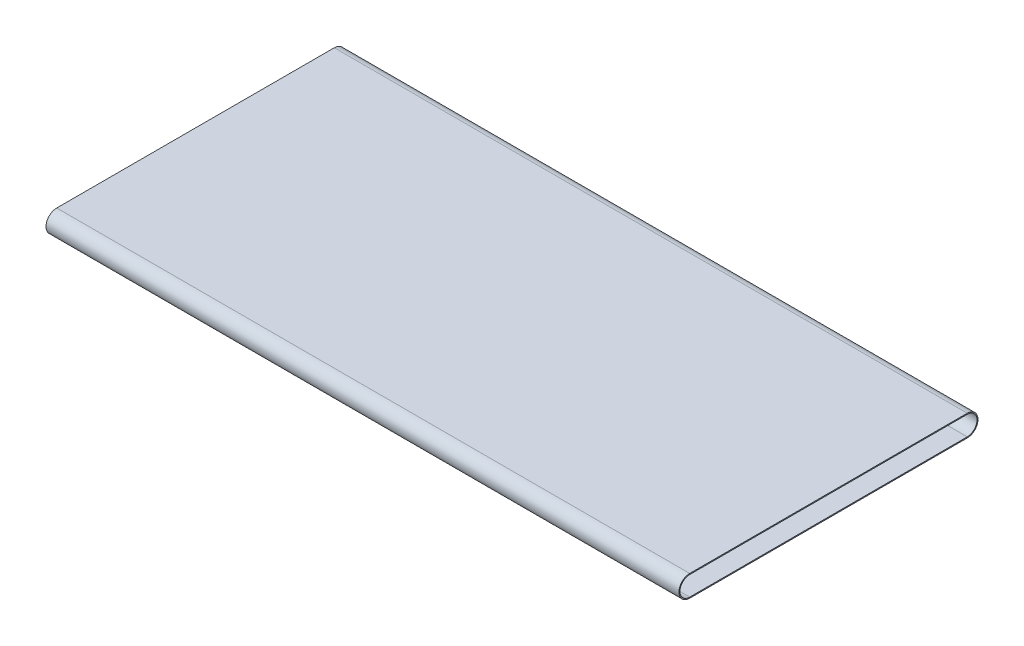
ISO-10303-21;
HEADER;
FILE_DESCRIPTION(('STEP AP214'),'2;1');
FILE_NAME('part.step','',(''),(''),'','','');
FILE_SCHEMA(('AUTOMOTIVE_DESIGN { 1 0 10303 214 1 1 1 1 }'));
ENDSEC;
DATA;
#1=APPLICATION_CONTEXT('core data for automotive mechanical design processes');
#2=APPLICATION_PROTOCOL_DEFINITION('international standard','automotive_design',2000,#1);
#3=PRODUCT_CONTEXT('',#1,'mechanical');
#4=PRODUCT('Part','Part','',(#3));
#5=PRODUCT_RELATED_PRODUCT_CATEGORY('part','',(#4));
#6=PRODUCT_DEFINITION_FORMATION('','',#4);
#7=PRODUCT_DEFINITION_CONTEXT('part definition',#1,'design');
#8=PRODUCT_DEFINITION('design','',#6,#7);
#9=PRODUCT_DEFINITION_SHAPE('','',#8);
#10=(LENGTH_UNIT() NAMED_UNIT(*) SI_UNIT(.MILLI.,.METRE.));
#11=(NAMED_UNIT(*) PLANE_ANGLE_UNIT() SI_UNIT($,.RADIAN.));
#12=(NAMED_UNIT(*) SI_UNIT($,.STERADIAN.) SOLID_ANGLE_UNIT());
#13=UNCERTAINTY_MEASURE_WITH_UNIT(LENGTH_MEASURE(1.E-05),#10,'distance_accuracy_value','');
#14=(GEOMETRIC_REPRESENTATION_CONTEXT(3) GLOBAL_UNCERTAINTY_ASSIGNED_CONTEXT((#13)) GLOBAL_UNIT_ASSIGNED_CONTEXT((#10,
#11,#12)) REPRESENTATION_CONTEXT('',''));
#15=CARTESIAN_POINT('',(0.,0.,0.));
#16=DIRECTION('',(0.,0.,1.));
#17=DIRECTION('',(1.,0.,0.));
#18=AXIS2_PLACEMENT_3D('',#15,#16,#17);
#19=CARTESIAN_POINT('',(3962.4,0.,0.));
#20=DIRECTION('',(1.,0.,0.));
#21=DIRECTION('',(0.,0.,-1.));
#22=AXIS2_PLACEMENT_3D('',#19,#20,#21);
#23=PLANE('',#22);
#24=CARTESIAN_POINT('',(3962.4,0.,0.));
#25=DIRECTION('',(1.,0.,0.));
#26=DIRECTION('',(0.,0.,-1.));
#27=AXIS2_PLACEMENT_3D('',#24,#25,#26);
#28=CIRCLE('',#27,67.31);
#29=CARTESIAN_POINT('',(3962.4,-67.31,0.));
#30=VERTEX_POINT('',#29);
#31=CARTESIAN_POINT('',(3962.4,67.31,0.));
#32=VERTEX_POINT('',#31);
#33=EDGE_CURVE('E137',#30,#32,#28,.T.);
#34=ORIENTED_EDGE('',*,*,#33,.T.);
#35=DIRECTION('',(0.,0.,1.));
#36=VECTOR('',#35,1.);
#37=CARTESIAN_POINT('',(3962.4,67.31,0.));
#38=LINE('',#37,#36);
#39=CARTESIAN_POINT('',(3962.4,67.3099999999999,1737.36));
#40=VERTEX_POINT('',#39);
#41=EDGE_CURVE('E140',#32,#40,#38,.T.);
#42=ORIENTED_EDGE('',*,*,#41,.T.);
#43=CARTESIAN_POINT('',(3962.4,0.,1737.36));
#44=DIRECTION('',(1.,0.,0.));
#45=DIRECTION('',(0.,0.,-1.));
#46=AXIS2_PLACEMENT_3D('',#43,#44,#45);
#47=CIRCLE('',#46,67.3099999999999);
#48=CARTESIAN_POINT('',(3962.4,-67.3099999999998,1737.36));
#49=VERTEX_POINT('',#48);
#50=EDGE_CURVE('E143',#40,#49,#47,.T.);
#51=ORIENTED_EDGE('',*,*,#50,.T.);
#52=DIRECTION('',(0.,0.,-1.));
#53=VECTOR('',#52,1.);
#54=CARTESIAN_POINT('',(3962.4,-67.31,0.));
#55=LINE('',#54,#53);
#56=EDGE_CURVE('E145',#49,#30,#55,.T.);
#57=ORIENTED_EDGE('',*,*,#56,.T.);
#58=EDGE_LOOP('',(#34,#42,#51,#57));
#59=FACE_BOUND('',#58,.T.);
#60=DIRECTION('',(0.,0.,1.));
#61=VECTOR('',#60,1.);
#62=CARTESIAN_POINT('',(3962.4,60.9599999999998,0.));
#63=LINE('',#62,#61);
#64=CARTESIAN_POINT('',(3962.4,60.9599999999998,0.));
#65=VERTEX_POINT('',#64);
#66=CARTESIAN_POINT('',(3962.4,60.9599999999998,1737.36));
#67=VERTEX_POINT('',#66);
#68=EDGE_CURVE('E109',#65,#67,#63,.T.);
#69=ORIENTED_EDGE('',*,*,#68,.F.);
#70=CARTESIAN_POINT('',(3962.4,0.,0.));
#71=DIRECTION('',(1.,0.,0.));
#72=DIRECTION('',(0.,0.,-1.));
#73=AXIS2_PLACEMENT_3D('',#70,#71,#72);
#74=CIRCLE('',#73,60.9599999999998);
#75=CARTESIAN_POINT('',(3962.4,-60.9599999999998,0.));
#76=VERTEX_POINT('',#75);
#77=EDGE_CURVE('E101',#76,#65,#74,.T.);
#78=ORIENTED_EDGE('',*,*,#77,.F.);
#79=DIRECTION('',(0.,0.,-1.));
#80=VECTOR('',#79,1.);
#81=CARTESIAN_POINT('',(3962.4,-60.9599999999998,0.));
#82=LINE('',#81,#80);
#83=CARTESIAN_POINT('',(3962.4,-60.96,1737.36));
#84=VERTEX_POINT('',#83);
#85=EDGE_CURVE('E123',#84,#76,#82,.T.);
#86=ORIENTED_EDGE('',*,*,#85,.F.);
#87=CARTESIAN_POINT('',(3962.4,0.,1737.36));
#88=DIRECTION('',(1.,0.,0.));
#89=DIRECTION('',(0.,0.,-1.));
#90=AXIS2_PLACEMENT_3D('',#87,#88,#89);
#91=CIRCLE('',#90,60.9599999999998);
#92=EDGE_CURVE('E121',#67,#84,#91,.T.);
#93=ORIENTED_EDGE('',*,*,#92,.F.);
#94=EDGE_LOOP('',(#69,#78,#86,#93));
#95=FACE_BOUND('',#94,.T.);
#96=ADVANCED_FACE('F36',(#59,#95),#23,.T.);
#97=CARTESIAN_POINT('',(0.,0.,0.));
#98=DIRECTION('',(1.,0.,0.));
#99=DIRECTION('',(0.,0.,-1.));
#100=AXIS2_PLACEMENT_3D('',#97,#98,#99);
#101=PLANE('',#100);
#102=CARTESIAN_POINT('',(0.,0.,0.));
#103=DIRECTION('',(1.,0.,0.));
#104=DIRECTION('',(0.,0.,-1.));
#105=AXIS2_PLACEMENT_3D('',#102,#103,#104);
#106=CIRCLE('',#105,67.31);
#107=CARTESIAN_POINT('',(0.,-67.31,0.));
#108=VERTEX_POINT('',#107);
#109=CARTESIAN_POINT('',(0.,67.31,0.));
#110=VERTEX_POINT('',#109);
#111=EDGE_CURVE('E117',#108,#110,#106,.T.);
#112=ORIENTED_EDGE('',*,*,#111,.F.);
#113=DIRECTION('',(0.,0.,-1.));
#114=VECTOR('',#113,1.);
#115=CARTESIAN_POINT('',(0.,-67.31,0.));
#116=LINE('',#115,#114);
#117=CARTESIAN_POINT('',(0.,-67.3099999999998,1737.36));
#118=VERTEX_POINT('',#117);
#119=EDGE_CURVE('E141',#118,#108,#116,.T.);
#120=ORIENTED_EDGE('',*,*,#119,.F.);
#121=CARTESIAN_POINT('',(0.,0.,1737.36));
#122=DIRECTION('',(1.,0.,0.));
#123=DIRECTION('',(0.,0.,-1.));
#124=AXIS2_PLACEMENT_3D('',#121,#122,#123);
#125=CIRCLE('',#124,67.3099999999999);
#126=CARTESIAN_POINT('',(0.,67.3099999999999,1737.36));
#127=VERTEX_POINT('',#126);
#128=EDGE_CURVE('E152',#127,#118,#125,.T.);
#129=ORIENTED_EDGE('',*,*,#128,.F.);
#130=DIRECTION('',(0.,0.,1.));
#131=VECTOR('',#130,1.);
#132=CARTESIAN_POINT('',(0.,67.31,0.));
#133=LINE('',#132,#131);
#134=EDGE_CURVE('E150',#110,#127,#133,.T.);
#135=ORIENTED_EDGE('',*,*,#134,.F.);
#136=EDGE_LOOP('',(#112,#120,#129,#135));
#137=FACE_BOUND('',#136,.T.);
#138=CARTESIAN_POINT('',(0.,0.,0.));
#139=DIRECTION('',(1.,0.,0.));
#140=DIRECTION('',(0.,0.,-1.));
#141=AXIS2_PLACEMENT_3D('',#138,#139,#140);
#142=CIRCLE('',#141,60.9599999999998);
#143=CARTESIAN_POINT('',(0.,-60.9599999999998,0.));
#144=VERTEX_POINT('',#143);
#145=CARTESIAN_POINT('',(0.,60.9599999999998,0.));
#146=VERTEX_POINT('',#145);
#147=EDGE_CURVE('E59',#144,#146,#142,.T.);
#148=ORIENTED_EDGE('',*,*,#147,.T.);
#149=DIRECTION('',(0.,0.,1.));
#150=VECTOR('',#149,1.);
#151=CARTESIAN_POINT('',(0.,60.9599999999998,0.));
#152=LINE('',#151,#150);
#153=CARTESIAN_POINT('',(0.,60.9599999999998,1737.36));
#154=VERTEX_POINT('',#153);
#155=EDGE_CURVE('E116',#146,#154,#152,.T.);
#156=ORIENTED_EDGE('',*,*,#155,.T.);
#157=CARTESIAN_POINT('',(0.,0.,1737.36));
#158=DIRECTION('',(1.,0.,0.));
#159=DIRECTION('',(0.,0.,-1.));
#160=AXIS2_PLACEMENT_3D('',#157,#158,#159);
#161=CIRCLE('',#160,60.9599999999998);
#162=CARTESIAN_POINT('',(0.,-60.96,1737.36));
#163=VERTEX_POINT('',#162);
#164=EDGE_CURVE('E129',#154,#163,#161,.T.);
#165=ORIENTED_EDGE('',*,*,#164,.T.);
#166=DIRECTION('',(0.,0.,-1.));
#167=VECTOR('',#166,1.);
#168=CARTESIAN_POINT('',(0.,-60.9599999999998,0.));
#169=LINE('',#168,#167);
#170=EDGE_CURVE('E110',#163,#144,#169,.T.);
#171=ORIENTED_EDGE('',*,*,#170,.T.);
#172=EDGE_LOOP('',(#148,#156,#165,#171));
#173=FACE_BOUND('',#172,.T.);
#174=ADVANCED_FACE('F170',(#137,#173),#101,.F.);
#175=CARTESIAN_POINT('',(3962.4,0.,0.));
#176=DIRECTION('',(-1.,0.,0.));
#177=DIRECTION('',(0.,0.,1.));
#178=AXIS2_PLACEMENT_3D('',#175,#176,#177);
#179=CYLINDRICAL_SURFACE('',#178,67.31);
#180=ORIENTED_EDGE('',*,*,#111,.T.);
#181=DIRECTION('',(-1.,0.,0.));
#182=VECTOR('',#181,1.);
#183=CARTESIAN_POINT('',(3962.4,67.31,0.));
#184=LINE('',#183,#182);
#185=EDGE_CURVE('E11',#32,#110,#184,.T.);
#186=ORIENTED_EDGE('',*,*,#185,.F.);
#187=ORIENTED_EDGE('',*,*,#33,.F.);
#188=DIRECTION('',(-1.,0.,0.));
#189=VECTOR('',#188,1.);
#190=CARTESIAN_POINT('',(3962.4,-67.31,0.));
#191=LINE('',#190,#189);
#192=EDGE_CURVE('E147',#30,#108,#191,.T.);
#193=ORIENTED_EDGE('',*,*,#192,.T.);
#194=EDGE_LOOP('',(#180,#186,#187,#193));
#195=FACE_BOUND('',#194,.T.);
#196=ADVANCED_FACE('F38',(#195),#179,.T.);
#197=CARTESIAN_POINT('',(3962.4,67.31,0.));
#198=DIRECTION('',(0.,-1.,0.));
#199=DIRECTION('',(0.,0.,-1.));
#200=AXIS2_PLACEMENT_3D('',#197,#198,#199);
#201=PLANE('',#200);
#202=ORIENTED_EDGE('',*,*,#134,.T.);
#203=DIRECTION('',(-1.,0.,0.));
#204=VECTOR('',#203,1.);
#205=CARTESIAN_POINT('',(3962.4,67.3099999999999,1737.36));
#206=LINE('',#205,#204);
#207=EDGE_CURVE('E44',#40,#127,#206,.T.);
#208=ORIENTED_EDGE('',*,*,#207,.F.);
#209=ORIENTED_EDGE('',*,*,#41,.F.);
#210=ORIENTED_EDGE('',*,*,#185,.T.);
#211=EDGE_LOOP('',(#202,#208,#209,#210));
#212=FACE_BOUND('',#211,.T.);
#213=ADVANCED_FACE('F180',(#212),#201,.F.);
#214=CARTESIAN_POINT('',(3962.4,0.,1737.36));
#215=DIRECTION('',(-1.,0.,0.));
#216=DIRECTION('',(0.,0.,1.));
#217=AXIS2_PLACEMENT_3D('',#214,#215,#216);
#218=CYLINDRICAL_SURFACE('',#217,67.3099999999999);
#219=ORIENTED_EDGE('',*,*,#128,.T.);
#220=DIRECTION('',(-1.,0.,0.));
#221=VECTOR('',#220,1.);
#222=CARTESIAN_POINT('',(3962.4,-67.3099999999998,1737.36));
#223=LINE('',#222,#221);
#224=EDGE_CURVE('E157',#49,#118,#223,.T.);
#225=ORIENTED_EDGE('',*,*,#224,.F.);
#226=ORIENTED_EDGE('',*,*,#50,.F.);
#227=ORIENTED_EDGE('',*,*,#207,.T.);
#228=EDGE_LOOP('',(#219,#225,#226,#227));
#229=FACE_BOUND('',#228,.T.);
#230=ADVANCED_FACE('F164',(#229),#218,.T.);
#231=CARTESIAN_POINT('',(3962.4,-67.31,0.));
#232=DIRECTION('',(0.,1.,0.));
#233=DIRECTION('',(0.,0.,1.));
#234=AXIS2_PLACEMENT_3D('',#231,#232,#233);
#235=PLANE('',#234);
#236=ORIENTED_EDGE('',*,*,#119,.T.);
#237=ORIENTED_EDGE('',*,*,#192,.F.);
#238=ORIENTED_EDGE('',*,*,#56,.F.);
#239=ORIENTED_EDGE('',*,*,#224,.T.);
#240=EDGE_LOOP('',(#236,#237,#238,#239));
#241=FACE_BOUND('',#240,.T.);
#242=ADVANCED_FACE('F174',(#241),#235,.F.);
#243=CARTESIAN_POINT('',(3962.4,0.,0.));
#244=DIRECTION('',(-1.,0.,0.));
#245=DIRECTION('',(0.,0.,1.));
#246=AXIS2_PLACEMENT_3D('',#243,#244,#245);
#247=CYLINDRICAL_SURFACE('',#246,60.9599999999998);
#248=ORIENTED_EDGE('',*,*,#147,.F.);
#249=DIRECTION('',(-1.,0.,0.));
#250=VECTOR('',#249,1.);
#251=CARTESIAN_POINT('',(3962.4,-60.9599999999998,0.));
#252=LINE('',#251,#250);
#253=EDGE_CURVE('E105',#76,#144,#252,.T.);
#254=ORIENTED_EDGE('',*,*,#253,.F.);
#255=ORIENTED_EDGE('',*,*,#77,.T.);
#256=DIRECTION('',(-1.,0.,0.));
#257=VECTOR('',#256,1.);
#258=CARTESIAN_POINT('',(3962.4,60.9599999999998,0.));
#259=LINE('',#258,#257);
#260=EDGE_CURVE('E104',#65,#146,#259,.T.);
#261=ORIENTED_EDGE('',*,*,#260,.T.);
#262=EDGE_LOOP('',(#248,#254,#255,#261));
#263=FACE_BOUND('',#262,.T.);
#264=ADVANCED_FACE('F103',(#263),#247,.F.);
#265=CARTESIAN_POINT('',(3962.4,60.9599999999998,0.));
#266=DIRECTION('',(0.,-1.,0.));
#267=DIRECTION('',(0.,0.,-1.));
#268=AXIS2_PLACEMENT_3D('',#265,#266,#267);
#269=PLANE('',#268);
#270=ORIENTED_EDGE('',*,*,#155,.F.);
#271=ORIENTED_EDGE('',*,*,#260,.F.);
#272=ORIENTED_EDGE('',*,*,#68,.T.);
#273=DIRECTION('',(-1.,0.,0.));
#274=VECTOR('',#273,1.);
#275=CARTESIAN_POINT('',(3962.4,60.9599999999998,1737.36));
#276=LINE('',#275,#274);
#277=EDGE_CURVE('E118',#67,#154,#276,.T.);
#278=ORIENTED_EDGE('',*,*,#277,.T.);
#279=EDGE_LOOP('',(#270,#271,#272,#278));
#280=FACE_BOUND('',#279,.T.);
#281=ADVANCED_FACE('F113',(#280),#269,.T.);
#282=CARTESIAN_POINT('',(3962.4,0.,1737.36));
#283=DIRECTION('',(-1.,0.,0.));
#284=DIRECTION('',(0.,0.,1.));
#285=AXIS2_PLACEMENT_3D('',#282,#283,#284);
#286=CYLINDRICAL_SURFACE('',#285,60.9599999999998);
#287=ORIENTED_EDGE('',*,*,#164,.F.);
#288=ORIENTED_EDGE('',*,*,#277,.F.);
#289=ORIENTED_EDGE('',*,*,#92,.T.);
#290=DIRECTION('',(-1.,0.,0.));
#291=VECTOR('',#290,1.);
#292=CARTESIAN_POINT('',(3962.4,-60.96,1737.36));
#293=LINE('',#292,#291);
#294=EDGE_CURVE('E51',#84,#163,#293,.T.);
#295=ORIENTED_EDGE('',*,*,#294,.T.);
#296=EDGE_LOOP('',(#287,#288,#289,#295));
#297=FACE_BOUND('',#296,.T.);
#298=ADVANCED_FACE('F203',(#297),#286,.F.);
#299=CARTESIAN_POINT('',(3962.4,-60.9599999999998,0.));
#300=DIRECTION('',(0.,1.,0.));
#301=DIRECTION('',(0.,0.,1.));
#302=AXIS2_PLACEMENT_3D('',#299,#300,#301);
#303=PLANE('',#302);
#304=ORIENTED_EDGE('',*,*,#170,.F.);
#305=ORIENTED_EDGE('',*,*,#294,.F.);
#306=ORIENTED_EDGE('',*,*,#85,.T.);
#307=ORIENTED_EDGE('',*,*,#253,.T.);
#308=EDGE_LOOP('',(#304,#305,#306,#307));
#309=FACE_BOUND('',#308,.T.);
#310=ADVANCED_FACE('F207',(#309),#303,.T.);
#311=CLOSED_SHELL('',(#96,#174,#196,#213,#230,#242,#264,#281,#298,#310));
#312=MANIFOLD_SOLID_BREP('B2',#311);
#313=ADVANCED_BREP_SHAPE_REPRESENTATION('',(#18,#312),#14);
#314=SHAPE_DEFINITION_REPRESENTATION(#9,#313);
ENDSEC;
END-ISO-10303-21;
